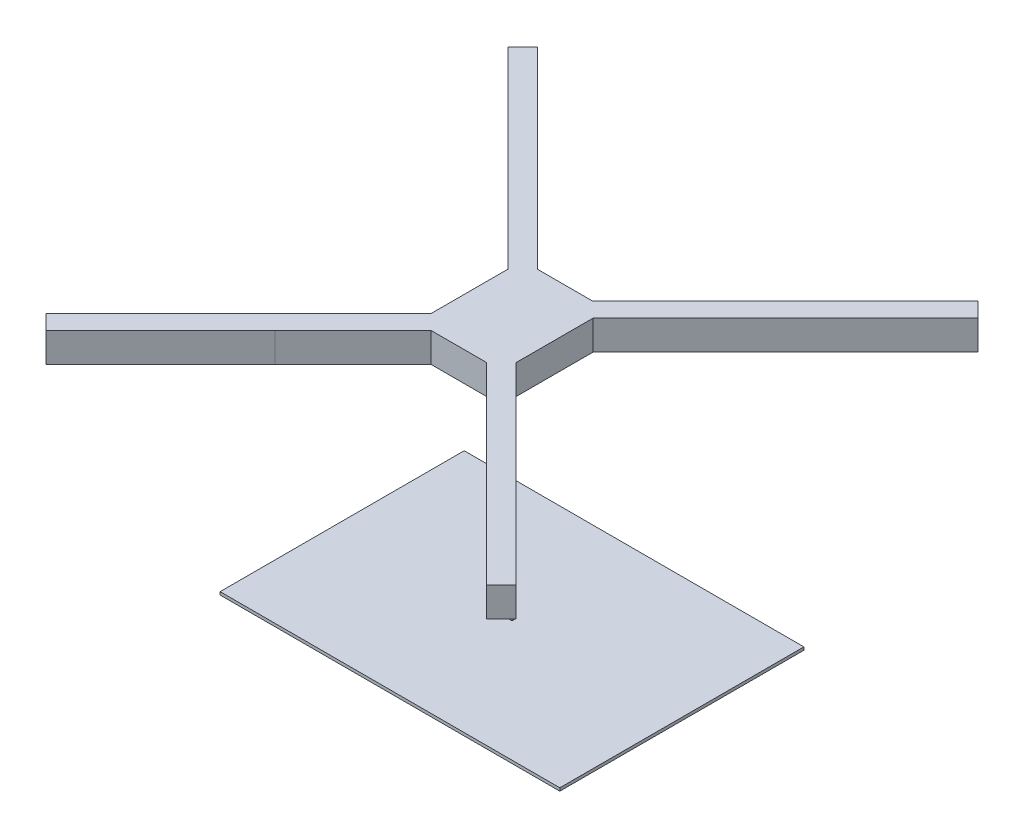
ISO-10303-21;
HEADER;
FILE_DESCRIPTION(('STEP AP214'),'2;1');
FILE_NAME('part.step','',(''),(''),'','','');
FILE_SCHEMA(('AUTOMOTIVE_DESIGN { 1 0 10303 214 1 1 1 1 }'));
ENDSEC;
DATA;
#1=APPLICATION_CONTEXT('core data for automotive mechanical design processes');
#2=APPLICATION_PROTOCOL_DEFINITION('international standard','automotive_design',2000,#1);
#3=PRODUCT_CONTEXT('',#1,'mechanical');
#4=PRODUCT('Part','Part','',(#3));
#5=PRODUCT_RELATED_PRODUCT_CATEGORY('part','',(#4));
#6=PRODUCT_DEFINITION_FORMATION('','',#4);
#7=PRODUCT_DEFINITION_CONTEXT('part definition',#1,'design');
#8=PRODUCT_DEFINITION('design','',#6,#7);
#9=PRODUCT_DEFINITION_SHAPE('','',#8);
#10=(LENGTH_UNIT() NAMED_UNIT(*) SI_UNIT(.MILLI.,.METRE.));
#11=(NAMED_UNIT(*) PLANE_ANGLE_UNIT() SI_UNIT($,.RADIAN.));
#12=(NAMED_UNIT(*) SI_UNIT($,.STERADIAN.) SOLID_ANGLE_UNIT());
#13=UNCERTAINTY_MEASURE_WITH_UNIT(LENGTH_MEASURE(1.E-05),#10,'distance_accuracy_value','');
#14=(GEOMETRIC_REPRESENTATION_CONTEXT(3) GLOBAL_UNCERTAINTY_ASSIGNED_CONTEXT((#13)) GLOBAL_UNIT_ASSIGNED_CONTEXT((#10,
#11,#12)) REPRESENTATION_CONTEXT('',''));
#15=CARTESIAN_POINT('',(0.,0.,0.));
#16=DIRECTION('',(0.,0.,1.));
#17=DIRECTION('',(1.,0.,0.));
#18=AXIS2_PLACEMENT_3D('',#15,#16,#17);
#19=CARTESIAN_POINT('',(37.7392834995965,40.,-72.1741021786564));
#20=DIRECTION('',(0.,0.,1.));
#21=DIRECTION('',(1.,0.,0.));
#22=AXIS2_PLACEMENT_3D('',#19,#20,#21);
#23=PLANE('',#22);
#24=DIRECTION('',(-1.,0.,0.));
#25=VECTOR('',#24,1.);
#26=CARTESIAN_POINT('',(37.7392834995965,0.,-72.1741021786564));
#27=LINE('',#26,#25);
#28=CARTESIAN_POINT('',(37.7392834995965,0.,-72.1741021786564));
#29=VERTEX_POINT('',#28);
#30=CARTESIAN_POINT('',(-37.7392819154021,0.,-72.1741021786564));
#31=VERTEX_POINT('',#30);
#32=EDGE_CURVE('E209',#29,#31,#27,.T.);
#33=ORIENTED_EDGE('',*,*,#32,.T.);
#34=DIRECTION('',(0.,-1.,0.));
#35=VECTOR('',#34,1.);
#36=CARTESIAN_POINT('',(-37.7392819154021,40.,-72.1741021786564));
#37=LINE('',#36,#35);
#38=CARTESIAN_POINT('',(-37.7392819154021,40.,-72.1741021786564));
#39=VERTEX_POINT('',#38);
#40=EDGE_CURVE('E11',#39,#31,#37,.T.);
#41=ORIENTED_EDGE('',*,*,#40,.F.);
#42=DIRECTION('',(-1.,0.,0.));
#43=VECTOR('',#42,1.);
#44=CARTESIAN_POINT('',(37.7392834995965,40.,-72.1741021786564));
#45=LINE('',#44,#43);
#46=CARTESIAN_POINT('',(37.7392834995965,40.,-72.1741021786564));
#47=VERTEX_POINT('',#46);
#48=EDGE_CURVE('E251',#47,#39,#45,.T.);
#49=ORIENTED_EDGE('',*,*,#48,.F.);
#50=DIRECTION('',(0.,-1.,0.));
#51=VECTOR('',#50,1.);
#52=CARTESIAN_POINT('',(37.7392834995965,40.,-72.1741021786564));
#53=LINE('',#52,#51);
#54=EDGE_CURVE('E205',#47,#29,#53,.T.);
#55=ORIENTED_EDGE('',*,*,#54,.T.);
#56=EDGE_LOOP('',(#33,#41,#49,#55));
#57=FACE_BOUND('',#56,.T.);
#58=ADVANCED_FACE('F37',(#57),#23,.F.);
#59=CARTESIAN_POINT('',(-143.805299093384,40.,-178.240119356639));
#60=DIRECTION('',(-0.707106781186548,0.,0.707106781186547));
#61=DIRECTION('',(0.707106781186547,0.,0.707106781186548));
#62=AXIS2_PLACEMENT_3D('',#59,#60,#61);
#63=PLANE('',#62);
#64=DIRECTION('',(-0.707106781186547,0.,-0.707106781186548));
#65=VECTOR('',#64,1.);
#66=CARTESIAN_POINT('',(-143.805299093384,0.,-178.240119356639));
#67=LINE('',#66,#65);
#68=CARTESIAN_POINT('',(-299.368790954425,0.,-333.803611217679));
#69=VERTEX_POINT('',#68);
#70=EDGE_CURVE('E212',#31,#69,#67,.T.);
#71=ORIENTED_EDGE('',*,*,#70,.T.);
#72=DIRECTION('',(0.,-1.,0.));
#73=VECTOR('',#72,1.);
#74=CARTESIAN_POINT('',(-299.368790954425,40.,-333.803611217679));
#75=LINE('',#74,#73);
#76=CARTESIAN_POINT('',(-299.368790954425,40.,-333.803611217679));
#77=VERTEX_POINT('',#76);
#78=EDGE_CURVE('E45',#77,#69,#75,.T.);
#79=ORIENTED_EDGE('',*,*,#78,.F.);
#80=DIRECTION('',(-0.707106781186548,0.,-0.707106781186547));
#81=VECTOR('',#80,1.);
#82=CARTESIAN_POINT('',(-37.7392819154021,40.,-72.1741021786564));
#83=LINE('',#82,#81);
#84=EDGE_CURVE('E133',#39,#77,#83,.T.);
#85=ORIENTED_EDGE('',*,*,#84,.F.);
#86=ORIENTED_EDGE('',*,*,#40,.T.);
#87=EDGE_LOOP('',(#71,#79,#85,#86));
#88=FACE_BOUND('',#87,.T.);
#89=ADVANCED_FACE('F368',(#88),#63,.F.);
#90=CARTESIAN_POINT('',(-299.368790954425,40.,-333.803611217679));
#91=DIRECTION('',(0.707106781186546,0.,0.707106781186549));
#92=DIRECTION('',(0.707106781186549,0.,-0.707106781186546));
#93=AXIS2_PLACEMENT_3D('',#90,#91,#92);
#94=PLANE('',#93);
#95=DIRECTION('',(-0.707106781186549,0.,0.707106781186546));
#96=VECTOR('',#95,1.);
#97=CARTESIAN_POINT('',(-299.368790954425,0.,-333.803611217679));
#98=LINE('',#97,#96);
#99=CARTESIAN_POINT('',(-319.36577072638,0.,-313.806631445723));
#100=VERTEX_POINT('',#99);
#101=EDGE_CURVE('E215',#69,#100,#98,.T.);
#102=ORIENTED_EDGE('',*,*,#101,.T.);
#103=DIRECTION('',(0.,-1.,0.));
#104=VECTOR('',#103,1.);
#105=CARTESIAN_POINT('',(-319.36577072638,40.,-313.806631445723));
#106=LINE('',#105,#104);
#107=CARTESIAN_POINT('',(-319.36577072638,40.,-313.806631445723));
#108=VERTEX_POINT('',#107);
#109=EDGE_CURVE('E294',#108,#100,#106,.T.);
#110=ORIENTED_EDGE('',*,*,#109,.F.);
#111=DIRECTION('',(-0.707106781186549,0.,0.707106781186546));
#112=VECTOR('',#111,1.);
#113=CARTESIAN_POINT('',(-299.368790954425,40.,-333.803611217679));
#114=LINE('',#113,#112);
#115=EDGE_CURVE('E302',#77,#108,#114,.T.);
#116=ORIENTED_EDGE('',*,*,#115,.F.);
#117=ORIENTED_EDGE('',*,*,#78,.T.);
#118=EDGE_LOOP('',(#102,#110,#116,#117));
#119=FACE_BOUND('',#118,.T.);
#120=ADVANCED_FACE('F300',(#119),#94,.F.);
#121=CARTESIAN_POINT('',(-163.802279668428,40.,-158.243140387771));
#122=DIRECTION('',(0.707106781186548,0.,-0.707106781186547));
#123=DIRECTION('',(-0.707106781186547,0.,-0.707106781186548));
#124=AXIS2_PLACEMENT_3D('',#121,#122,#123);
#125=PLANE('',#124);
#126=DIRECTION('',(0.707106781186547,0.,0.707106781186548));
#127=VECTOR('',#126,1.);
#128=CARTESIAN_POINT('',(-163.802279668428,0.,-158.243140387771));
#129=LINE('',#128,#127);
#130=CARTESIAN_POINT('',(-163.802279668428,0.,-158.243140387771));
#131=VERTEX_POINT('',#130);
#132=EDGE_CURVE('E217',#100,#131,#129,.T.);
#133=ORIENTED_EDGE('',*,*,#132,.T.);
#134=DIRECTION('',(0.,-1.,0.));
#135=VECTOR('',#134,1.);
#136=CARTESIAN_POINT('',(-163.802279668428,40.,-158.243140387771));
#137=LINE('',#136,#135);
#138=CARTESIAN_POINT('',(-163.802279668428,40.,-158.243140387771));
#139=VERTEX_POINT('',#138);
#140=EDGE_CURVE('E291',#139,#131,#137,.T.);
#141=ORIENTED_EDGE('',*,*,#140,.F.);
#142=DIRECTION('',(0.707106781186547,0.,0.707106781186548));
#143=VECTOR('',#142,1.);
#144=CARTESIAN_POINT('',(-163.802279668428,40.,-158.243140387771));
#145=LINE('',#144,#143);
#146=EDGE_CURVE('E320',#108,#139,#145,.T.);
#147=ORIENTED_EDGE('',*,*,#146,.F.);
#148=ORIENTED_EDGE('',*,*,#109,.T.);
#149=EDGE_LOOP('',(#133,#141,#147,#148));
#150=FACE_BOUND('',#149,.T.);
#151=ADVANCED_FACE('F311',(#150),#125,.F.);
#152=CARTESIAN_POINT('',(-163.802279668428,40.,-158.243140387771));
#153=DIRECTION('',(0.707126915378764,0.,-0.707086646421013));
#154=DIRECTION('',(-0.707086646421013,0.,-0.707126915378764));
#155=AXIS2_PLACEMENT_3D('',#152,#153,#154);
#156=PLANE('',#155);
#157=DIRECTION('',(0.707086646421013,0.,0.707126915378764));
#158=VECTOR('',#157,1.);
#159=CARTESIAN_POINT('',(-163.802279668428,0.,-158.243140387771));
#160=LINE('',#159,#158);
#161=CARTESIAN_POINT('',(-57.7392827052757,0.,-52.1741030809562));
#162=VERTEX_POINT('',#161);
#163=EDGE_CURVE('E219',#131,#162,#160,.T.);
#164=ORIENTED_EDGE('',*,*,#163,.T.);
#165=DIRECTION('',(0.,-1.,0.));
#166=VECTOR('',#165,1.);
#167=CARTESIAN_POINT('',(-57.7392827052757,40.,-52.1741030809562));
#168=LINE('',#167,#166);
#169=CARTESIAN_POINT('',(-57.7392827052757,40.,-52.1741030809562));
#170=VERTEX_POINT('',#169);
#171=EDGE_CURVE('E288',#170,#162,#168,.T.);
#172=ORIENTED_EDGE('',*,*,#171,.F.);
#173=DIRECTION('',(0.707086646421013,0.,0.707126915378764));
#174=VECTOR('',#173,1.);
#175=CARTESIAN_POINT('',(-163.802279668428,40.,-158.243140387771));
#176=LINE('',#175,#174);
#177=EDGE_CURVE('E317',#139,#170,#176,.T.);
#178=ORIENTED_EDGE('',*,*,#177,.F.);
#179=ORIENTED_EDGE('',*,*,#140,.T.);
#180=EDGE_LOOP('',(#164,#172,#178,#179));
#181=FACE_BOUND('',#180,.T.);
#182=ADVANCED_FACE('F315',(#181),#156,.F.);
#183=CARTESIAN_POINT('',(-57.7392827052757,40.,52.1741032715324));
#184=DIRECTION('',(1.,0.,0.));
#185=DIRECTION('',(0.,0.,-1.));
#186=AXIS2_PLACEMENT_3D('',#183,#184,#185);
#187=PLANE('',#186);
#188=DIRECTION('',(0.,0.,1.));
#189=VECTOR('',#188,1.);
#190=CARTESIAN_POINT('',(-57.7392827052757,0.,52.1741032715324));
#191=LINE('',#190,#189);
#192=CARTESIAN_POINT('',(-57.7392827052757,0.,52.1741032715324));
#193=VERTEX_POINT('',#192);
#194=EDGE_CURVE('E221',#162,#193,#191,.T.);
#195=ORIENTED_EDGE('',*,*,#194,.T.);
#196=DIRECTION('',(0.,-1.,0.));
#197=VECTOR('',#196,1.);
#198=CARTESIAN_POINT('',(-57.7392827052757,40.,52.1741032715324));
#199=LINE('',#198,#197);
#200=CARTESIAN_POINT('',(-57.7392827052757,40.,52.1741032715324));
#201=VERTEX_POINT('',#200);
#202=EDGE_CURVE('E285',#201,#193,#199,.T.);
#203=ORIENTED_EDGE('',*,*,#202,.F.);
#204=DIRECTION('',(0.,0.,1.));
#205=VECTOR('',#204,1.);
#206=CARTESIAN_POINT('',(-57.7392827052757,40.,52.1741032715324));
#207=LINE('',#206,#205);
#208=EDGE_CURVE('E319',#170,#201,#207,.T.);
#209=ORIENTED_EDGE('',*,*,#208,.F.);
#210=ORIENTED_EDGE('',*,*,#171,.T.);
#211=EDGE_LOOP('',(#195,#203,#209,#210));
#212=FACE_BOUND('',#211,.T.);
#213=ADVANCED_FACE('F381',(#212),#187,.F.);
#214=CARTESIAN_POINT('',(-163.802279840264,40.,158.24314040652));
#215=DIRECTION('',(0.707126914233252,0.,0.70708664756659));
#216=DIRECTION('',(0.70708664756659,0.,-0.707126914233252));
#217=AXIS2_PLACEMENT_3D('',#214,#215,#216);
#218=PLANE('',#217);
#219=DIRECTION('',(-0.70708664756659,0.,0.707126914233252));
#220=VECTOR('',#219,1.);
#221=CARTESIAN_POINT('',(-163.802279840264,0.,158.24314040652));
#222=LINE('',#221,#220);
#223=CARTESIAN_POINT('',(-319.361342304914,0.,313.811061537836));
#224=VERTEX_POINT('',#223);
#225=EDGE_CURVE('E224',#193,#224,#222,.T.);
#226=ORIENTED_EDGE('',*,*,#225,.T.);
#227=DIRECTION('',(0.,-1.,0.));
#228=VECTOR('',#227,1.);
#229=CARTESIAN_POINT('',(-319.361342304914,40.,313.811061537836));
#230=LINE('',#229,#228);
#231=CARTESIAN_POINT('',(-319.361342304914,40.,313.811061537836));
#232=VERTEX_POINT('',#231);
#233=EDGE_CURVE('E282',#232,#224,#230,.T.);
#234=ORIENTED_EDGE('',*,*,#233,.F.);
#235=DIRECTION('',(-0.70708664756659,0.,0.707126914233252));
#236=VECTOR('',#235,1.);
#237=CARTESIAN_POINT('',(-57.7392827052757,40.,52.1741032715324));
#238=LINE('',#237,#236);
#239=EDGE_CURVE('E322',#201,#232,#238,.T.);
#240=ORIENTED_EDGE('',*,*,#239,.F.);
#241=ORIENTED_EDGE('',*,*,#202,.T.);
#242=EDGE_LOOP('',(#226,#234,#240,#241));
#243=FACE_BOUND('',#242,.T.);
#244=ADVANCED_FACE('F384',(#243),#218,.F.);
#245=CARTESIAN_POINT('',(-319.361342304914,40.,313.811061537836));
#246=DIRECTION('',(0.70708664756659,0.,-0.707126914233251));
#247=DIRECTION('',(-0.707126914233252,0.,-0.707086647566591));
#248=AXIS2_PLACEMENT_3D('',#245,#246,#247);
#249=PLANE('',#248);
#250=DIRECTION('',(0.707126914233251,0.,0.70708664756659));
#251=VECTOR('',#250,1.);
#252=CARTESIAN_POINT('',(-319.361342304914,0.,313.811061537836));
#253=LINE('',#252,#251);
#254=CARTESIAN_POINT('',(-299.363793170398,0.,333.807471931019));
#255=VERTEX_POINT('',#254);
#256=EDGE_CURVE('E226',#224,#255,#253,.T.);
#257=ORIENTED_EDGE('',*,*,#256,.T.);
#258=DIRECTION('',(0.,-1.,0.));
#259=VECTOR('',#258,1.);
#260=CARTESIAN_POINT('',(-299.363793170398,40.,333.807471931019));
#261=LINE('',#260,#259);
#262=CARTESIAN_POINT('',(-299.363793170398,40.,333.807471931019));
#263=VERTEX_POINT('',#262);
#264=EDGE_CURVE('E279',#263,#255,#261,.T.);
#265=ORIENTED_EDGE('',*,*,#264,.F.);
#266=DIRECTION('',(0.707126914233251,0.,0.70708664756659));
#267=VECTOR('',#266,1.);
#268=CARTESIAN_POINT('',(-319.361342304914,40.,313.811061537836));
#269=LINE('',#268,#267);
#270=EDGE_CURVE('E328',#232,#263,#269,.T.);
#271=ORIENTED_EDGE('',*,*,#270,.F.);
#272=ORIENTED_EDGE('',*,*,#233,.T.);
#273=EDGE_LOOP('',(#257,#265,#271,#272));
#274=FACE_BOUND('',#273,.T.);
#275=ADVANCED_FACE('F388',(#274),#249,.F.);
#276=CARTESIAN_POINT('',(-143.805300025315,40.,178.240120135482));
#277=DIRECTION('',(-0.70712691427009,0.,-0.70708664752975));
#278=DIRECTION('',(-0.70708664752975,0.,0.70712691427009));
#279=AXIS2_PLACEMENT_3D('',#276,#277,#278);
#280=PLANE('',#279);
#281=DIRECTION('',(0.70708664752975,0.,-0.70712691427009));
#282=VECTOR('',#281,1.);
#283=CARTESIAN_POINT('',(-143.805300025315,0.,178.240120135482));
#284=LINE('',#283,#282);
#285=CARTESIAN_POINT('',(-143.805300025315,0.,178.240120135482));
#286=VERTEX_POINT('',#285);
#287=EDGE_CURVE('E228',#255,#286,#284,.T.);
#288=ORIENTED_EDGE('',*,*,#287,.T.);
#289=DIRECTION('',(0.,-1.,0.));
#290=VECTOR('',#289,1.);
#291=CARTESIAN_POINT('',(-143.805300025315,40.,178.240120135482));
#292=LINE('',#291,#290);
#293=CARTESIAN_POINT('',(-143.805300025315,40.,178.240120135482));
#294=VERTEX_POINT('',#293);
#295=EDGE_CURVE('E276',#294,#286,#292,.T.);
#296=ORIENTED_EDGE('',*,*,#295,.F.);
#297=DIRECTION('',(0.70708664752975,0.,-0.70712691427009));
#298=VECTOR('',#297,1.);
#299=CARTESIAN_POINT('',(-143.805300025315,40.,178.240120135482));
#300=LINE('',#299,#298);
#301=EDGE_CURVE('E330',#263,#294,#300,.T.);
#302=ORIENTED_EDGE('',*,*,#301,.F.);
#303=ORIENTED_EDGE('',*,*,#264,.T.);
#304=EDGE_LOOP('',(#288,#296,#302,#303));
#305=FACE_BOUND('',#304,.T.);
#306=ADVANCED_FACE('F392',(#305),#280,.F.);
#307=CARTESIAN_POINT('',(-143.805300025315,40.,178.240120135482));
#308=DIRECTION('',(-0.707106781186548,0.,-0.707106781186547));
#309=DIRECTION('',(-0.707106781186547,0.,0.707106781186548));
#310=AXIS2_PLACEMENT_3D('',#307,#308,#309);
#311=PLANE('',#310);
#312=DIRECTION('',(0.707106781186547,0.,-0.707106781186548));
#313=VECTOR('',#312,1.);
#314=CARTESIAN_POINT('',(-143.805300025315,0.,178.240120135482));
#315=LINE('',#314,#313);
#316=CARTESIAN_POINT('',(-37.7392828473326,0.,72.1741029574998));
#317=VERTEX_POINT('',#316);
#318=EDGE_CURVE('E230',#286,#317,#315,.T.);
#319=ORIENTED_EDGE('',*,*,#318,.T.);
#320=DIRECTION('',(0.,-1.,0.));
#321=VECTOR('',#320,1.);
#322=CARTESIAN_POINT('',(-37.7392828473326,40.,72.1741029574998));
#323=LINE('',#322,#321);
#324=CARTESIAN_POINT('',(-37.7392828473326,40.,72.1741029574998));
#325=VERTEX_POINT('',#324);
#326=EDGE_CURVE('E273',#325,#317,#323,.T.);
#327=ORIENTED_EDGE('',*,*,#326,.F.);
#328=DIRECTION('',(0.707106781186547,0.,-0.707106781186548));
#329=VECTOR('',#328,1.);
#330=CARTESIAN_POINT('',(-143.805300025315,40.,178.240120135482));
#331=LINE('',#330,#329);
#332=EDGE_CURVE('E332',#294,#325,#331,.T.);
#333=ORIENTED_EDGE('',*,*,#332,.F.);
#334=ORIENTED_EDGE('',*,*,#295,.T.);
#335=EDGE_LOOP('',(#319,#327,#333,#334));
#336=FACE_BOUND('',#335,.T.);
#337=ADVANCED_FACE('F396',(#336),#311,.F.);
#338=CARTESIAN_POINT('',(-37.7392828473326,40.,72.1741029574998));
#339=DIRECTION('',(0.,0.,-1.));
#340=DIRECTION('',(-1.,0.,0.));
#341=AXIS2_PLACEMENT_3D('',#338,#339,#340);
#342=PLANE('',#341);
#343=DIRECTION('',(1.,0.,0.));
#344=VECTOR('',#343,1.);
#345=CARTESIAN_POINT('',(-37.7392828473326,0.,72.1741029574998));
#346=LINE('',#345,#344);
#347=CARTESIAN_POINT('',(37.739282893414,0.,72.1741029574998));
#348=VERTEX_POINT('',#347);
#349=EDGE_CURVE('E232',#317,#348,#346,.T.);
#350=ORIENTED_EDGE('',*,*,#349,.T.);
#351=DIRECTION('',(0.,-1.,0.));
#352=VECTOR('',#351,1.);
#353=CARTESIAN_POINT('',(37.739282893414,40.,72.1741029574998));
#354=LINE('',#353,#352);
#355=CARTESIAN_POINT('',(37.739282893414,40.,72.1741029574998));
#356=VERTEX_POINT('',#355);
#357=EDGE_CURVE('E270',#356,#348,#354,.T.);
#358=ORIENTED_EDGE('',*,*,#357,.F.);
#359=DIRECTION('',(1.,0.,0.));
#360=VECTOR('',#359,1.);
#361=CARTESIAN_POINT('',(-37.7392828473326,40.,72.1741029574998));
#362=LINE('',#361,#360);
#363=EDGE_CURVE('E334',#325,#356,#362,.T.);
#364=ORIENTED_EDGE('',*,*,#363,.F.);
#365=ORIENTED_EDGE('',*,*,#326,.T.);
#366=EDGE_LOOP('',(#350,#358,#364,#365));
#367=FACE_BOUND('',#366,.T.);
#368=ADVANCED_FACE('F400',(#367),#342,.F.);
#369=CARTESIAN_POINT('',(143.805300071396,40.,178.240120135482));
#370=DIRECTION('',(0.707106781186548,0.,-0.707106781186547));
#371=DIRECTION('',(-0.707106781186547,0.,-0.707106781186548));
#372=AXIS2_PLACEMENT_3D('',#369,#370,#371);
#373=PLANE('',#372);
#374=DIRECTION('',(0.707106781186547,0.,0.707106781186548));
#375=VECTOR('',#374,1.);
#376=CARTESIAN_POINT('',(143.805300071396,0.,178.240120135482));
#377=LINE('',#376,#375);
#378=CARTESIAN_POINT('',(299.368791932436,0.,333.803611996522));
#379=VERTEX_POINT('',#378);
#380=EDGE_CURVE('E235',#348,#379,#377,.T.);
#381=ORIENTED_EDGE('',*,*,#380,.T.);
#382=DIRECTION('',(0.,-1.,0.));
#383=VECTOR('',#382,1.);
#384=CARTESIAN_POINT('',(299.368791932436,40.,333.803611996522));
#385=LINE('',#384,#383);
#386=CARTESIAN_POINT('',(299.368791932436,40.,333.803611996522));
#387=VERTEX_POINT('',#386);
#388=EDGE_CURVE('E267',#387,#379,#385,.T.);
#389=ORIENTED_EDGE('',*,*,#388,.F.);
#390=DIRECTION('',(0.707106781186548,0.,0.707106781186548));
#391=VECTOR('',#390,1.);
#392=CARTESIAN_POINT('',(37.739282893414,40.,72.1741029574998));
#393=LINE('',#392,#391);
#394=EDGE_CURVE('E336',#356,#387,#393,.T.);
#395=ORIENTED_EDGE('',*,*,#394,.F.);
#396=ORIENTED_EDGE('',*,*,#357,.T.);
#397=EDGE_LOOP('',(#381,#389,#395,#396));
#398=FACE_BOUND('',#397,.T.);
#399=ADVANCED_FACE('F404',(#398),#373,.F.);
#400=CARTESIAN_POINT('',(299.368791932436,40.,333.803611996522));
#401=DIRECTION('',(-0.707106781186548,0.,-0.707106781186547));
#402=DIRECTION('',(-0.707106781186547,0.,0.707106781186548));
#403=AXIS2_PLACEMENT_3D('',#400,#401,#402);
#404=PLANE('',#403);
#405=DIRECTION('',(0.707106781186547,0.,-0.707106781186548));
#406=VECTOR('',#405,1.);
#407=CARTESIAN_POINT('',(299.368791932436,0.,333.803611996522));
#408=LINE('',#407,#406);
#409=CARTESIAN_POINT('',(319.365771704392,0.,313.806632224567));
#410=VERTEX_POINT('',#409);
#411=EDGE_CURVE('E237',#379,#410,#408,.T.);
#412=ORIENTED_EDGE('',*,*,#411,.T.);
#413=DIRECTION('',(0.,-1.,0.));
#414=VECTOR('',#413,1.);
#415=CARTESIAN_POINT('',(319.365771704392,40.,313.806632224567));
#416=LINE('',#415,#414);
#417=CARTESIAN_POINT('',(319.365771704392,40.,313.806632224567));
#418=VERTEX_POINT('',#417);
#419=EDGE_CURVE('E264',#418,#410,#416,.T.);
#420=ORIENTED_EDGE('',*,*,#419,.F.);
#421=DIRECTION('',(0.707106781186547,0.,-0.707106781186548));
#422=VECTOR('',#421,1.);
#423=CARTESIAN_POINT('',(299.368791932436,40.,333.803611996522));
#424=LINE('',#423,#422);
#425=EDGE_CURVE('E338',#387,#418,#424,.T.);
#426=ORIENTED_EDGE('',*,*,#425,.F.);
#427=ORIENTED_EDGE('',*,*,#388,.T.);
#428=EDGE_LOOP('',(#412,#420,#426,#427));
#429=FACE_BOUND('',#428,.T.);
#430=ADVANCED_FACE('F408',(#429),#404,.F.);
#431=CARTESIAN_POINT('',(319.365771704392,40.,313.806632224567));
#432=DIRECTION('',(-0.707106781186547,0.,0.707106781186548));
#433=DIRECTION('',(0.707106781186548,0.,0.707106781186547));
#434=AXIS2_PLACEMENT_3D('',#431,#432,#433);
#435=PLANE('',#434);
#436=DIRECTION('',(-0.707106781186548,0.,-0.707106781186547));
#437=VECTOR('',#436,1.);
#438=CARTESIAN_POINT('',(319.365771704392,0.,313.806632224567));
#439=LINE('',#438,#437);
#440=CARTESIAN_POINT('',(163.802280352179,0.,158.243140872353));
#441=VERTEX_POINT('',#440);
#442=EDGE_CURVE('E239',#410,#441,#439,.T.);
#443=ORIENTED_EDGE('',*,*,#442,.T.);
#444=DIRECTION('',(0.,-1.,0.));
#445=VECTOR('',#444,1.);
#446=CARTESIAN_POINT('',(163.802280352179,40.,158.243140872353));
#447=LINE('',#446,#445);
#448=CARTESIAN_POINT('',(163.802280352179,40.,158.243140872353));
#449=VERTEX_POINT('',#448);
#450=EDGE_CURVE('E261',#449,#441,#447,.T.);
#451=ORIENTED_EDGE('',*,*,#450,.F.);
#452=DIRECTION('',(-0.707106781186548,0.,-0.707106781186547));
#453=VECTOR('',#452,1.);
#454=CARTESIAN_POINT('',(319.365771704392,40.,313.806632224567));
#455=LINE('',#454,#453);
#456=EDGE_CURVE('E340',#418,#449,#455,.T.);
#457=ORIENTED_EDGE('',*,*,#456,.F.);
#458=ORIENTED_EDGE('',*,*,#419,.T.);
#459=EDGE_LOOP('',(#443,#451,#457,#458));
#460=FACE_BOUND('',#459,.T.);
#461=ADVANCED_FACE('F412',(#460),#435,.F.);
#462=CARTESIAN_POINT('',(163.802280352179,40.,158.243140872353));
#463=DIRECTION('',(-0.707126915313853,0.,0.707086646485928));
#464=DIRECTION('',(0.707086646485928,0.,0.707126915313853));
#465=AXIS2_PLACEMENT_3D('',#462,#463,#464);
#466=PLANE('',#465);
#467=DIRECTION('',(-0.707086646485928,0.,-0.707126915313853));
#468=VECTOR('',#467,1.);
#469=CARTESIAN_POINT('',(163.802280352179,0.,158.243140872353));
#470=LINE('',#469,#468);
#471=CARTESIAN_POINT('',(57.7392833792894,0.,52.1741035752755));
#472=VERTEX_POINT('',#471);
#473=EDGE_CURVE('E241',#441,#472,#470,.T.);
#474=ORIENTED_EDGE('',*,*,#473,.T.);
#475=DIRECTION('',(0.,-1.,0.));
#476=VECTOR('',#475,1.);
#477=CARTESIAN_POINT('',(57.7392833792894,40.,52.1741035752755));
#478=LINE('',#477,#476);
#479=CARTESIAN_POINT('',(57.7392833792894,40.,52.1741035752755));
#480=VERTEX_POINT('',#479);
#481=EDGE_CURVE('E258',#480,#472,#478,.T.);
#482=ORIENTED_EDGE('',*,*,#481,.F.);
#483=DIRECTION('',(-0.707086646485928,0.,-0.707126915313853));
#484=VECTOR('',#483,1.);
#485=CARTESIAN_POINT('',(163.802280352179,40.,158.243140872353));
#486=LINE('',#485,#484);
#487=EDGE_CURVE('E342',#449,#480,#486,.T.);
#488=ORIENTED_EDGE('',*,*,#487,.F.);
#489=ORIENTED_EDGE('',*,*,#450,.T.);
#490=EDGE_LOOP('',(#474,#482,#488,#489));
#491=FACE_BOUND('',#490,.T.);
#492=ADVANCED_FACE('F416',(#491),#466,.F.);
#493=CARTESIAN_POINT('',(57.7392833792894,40.,-52.174102470969));
#494=DIRECTION('',(-1.,0.,0.));
#495=DIRECTION('',(0.,0.,1.));
#496=AXIS2_PLACEMENT_3D('',#493,#494,#495);
#497=PLANE('',#496);
#498=DIRECTION('',(0.,0.,-1.));
#499=VECTOR('',#498,1.);
#500=CARTESIAN_POINT('',(57.7392833792894,0.,-52.174102470969));
#501=LINE('',#500,#499);
#502=CARTESIAN_POINT('',(57.7392833792894,0.,-52.174102470969));
#503=VERTEX_POINT('',#502);
#504=EDGE_CURVE('E243',#472,#503,#501,.T.);
#505=ORIENTED_EDGE('',*,*,#504,.T.);
#506=DIRECTION('',(0.,-1.,0.));
#507=VECTOR('',#506,1.);
#508=CARTESIAN_POINT('',(57.7392833792894,40.,-52.174102470969));
#509=LINE('',#508,#507);
#510=CARTESIAN_POINT('',(57.7392833792894,40.,-52.174102470969));
#511=VERTEX_POINT('',#510);
#512=EDGE_CURVE('E255',#511,#503,#509,.T.);
#513=ORIENTED_EDGE('',*,*,#512,.F.);
#514=DIRECTION('',(0.,0.,-1.));
#515=VECTOR('',#514,1.);
#516=CARTESIAN_POINT('',(57.7392833792894,40.,-52.174102470969));
#517=LINE('',#516,#515);
#518=EDGE_CURVE('E344',#480,#511,#517,.T.);
#519=ORIENTED_EDGE('',*,*,#518,.F.);
#520=ORIENTED_EDGE('',*,*,#481,.T.);
#521=EDGE_LOOP('',(#505,#513,#519,#520));
#522=FACE_BOUND('',#521,.T.);
#523=ADVANCED_FACE('F350',(#522),#497,.F.);
#524=CARTESIAN_POINT('',(163.802280508752,40.,-158.243139611482));
#525=DIRECTION('',(-0.70712691427009,0.,-0.70708664752975));
#526=DIRECTION('',(-0.70708664752975,0.,0.70712691427009));
#527=AXIS2_PLACEMENT_3D('',#524,#525,#526);
#528=PLANE('',#527);
#529=DIRECTION('',(0.70708664752975,0.,-0.70712691427009));
#530=VECTOR('',#529,1.);
#531=CARTESIAN_POINT('',(163.802280508752,0.,-158.243139611482));
#532=LINE('',#531,#530);
#533=CARTESIAN_POINT('',(319.361342965297,0.,-313.811060750902));
#534=VERTEX_POINT('',#533);
#535=EDGE_CURVE('E246',#503,#534,#532,.T.);
#536=ORIENTED_EDGE('',*,*,#535,.T.);
#537=DIRECTION('',(0.,-1.,0.));
#538=VECTOR('',#537,1.);
#539=CARTESIAN_POINT('',(319.361342965297,40.,-313.811060750902));
#540=LINE('',#539,#538);
#541=CARTESIAN_POINT('',(319.361342965297,40.,-313.811060750902));
#542=VERTEX_POINT('',#541);
#543=EDGE_CURVE('E200',#542,#534,#540,.T.);
#544=ORIENTED_EDGE('',*,*,#543,.F.);
#545=DIRECTION('',(0.70708664752975,0.,-0.70712691427009));
#546=VECTOR('',#545,1.);
#547=CARTESIAN_POINT('',(163.802280508752,40.,-158.243139611482));
#548=LINE('',#547,#546);
#549=EDGE_CURVE('E191',#511,#542,#548,.T.);
#550=ORIENTED_EDGE('',*,*,#549,.F.);
#551=ORIENTED_EDGE('',*,*,#512,.T.);
#552=EDGE_LOOP('',(#536,#544,#550,#551));
#553=FACE_BOUND('',#552,.T.);
#554=ADVANCED_FACE('F353',(#553),#528,.F.);
#555=CARTESIAN_POINT('',(319.361342965297,40.,-313.811060750902));
#556=DIRECTION('',(-0.707086647529751,0.,0.707126914270089));
#557=DIRECTION('',(0.707126914270089,0.,0.707086647529751));
#558=AXIS2_PLACEMENT_3D('',#555,#556,#557);
#559=PLANE('',#558);
#560=DIRECTION('',(-0.707126914270089,0.,-0.707086647529751));
#561=VECTOR('',#560,1.);
#562=CARTESIAN_POINT('',(319.361342965297,0.,-313.811060750902));
#563=LINE('',#562,#561);
#564=CARTESIAN_POINT('',(299.363793829739,0.,-333.807471143044));
#565=VERTEX_POINT('',#564);
#566=EDGE_CURVE('E199',#534,#565,#563,.T.);
#567=ORIENTED_EDGE('',*,*,#566,.T.);
#568=DIRECTION('',(0.,-1.,0.));
#569=VECTOR('',#568,1.);
#570=CARTESIAN_POINT('',(299.363793829739,40.,-333.807471143044));
#571=LINE('',#570,#569);
#572=CARTESIAN_POINT('',(299.363793829739,40.,-333.807471143044));
#573=VERTEX_POINT('',#572);
#574=EDGE_CURVE('E196',#573,#565,#571,.T.);
#575=ORIENTED_EDGE('',*,*,#574,.F.);
#576=DIRECTION('',(-0.707126914270089,0.,-0.707086647529751));
#577=VECTOR('',#576,1.);
#578=CARTESIAN_POINT('',(319.361342965297,40.,-313.811060750902));
#579=LINE('',#578,#577);
#580=EDGE_CURVE('E185',#542,#573,#579,.T.);
#581=ORIENTED_EDGE('',*,*,#580,.F.);
#582=ORIENTED_EDGE('',*,*,#543,.T.);
#583=EDGE_LOOP('',(#567,#575,#581,#582));
#584=FACE_BOUND('',#583,.T.);
#585=ADVANCED_FACE('F197',(#584),#559,.F.);
#586=CARTESIAN_POINT('',(143.805300677579,40.,-178.240119356639));
#587=DIRECTION('',(0.707126914233252,0.,0.70708664756659));
#588=DIRECTION('',(0.70708664756659,0.,-0.707126914233252));
#589=AXIS2_PLACEMENT_3D('',#586,#587,#588);
#590=PLANE('',#589);
#591=DIRECTION('',(-0.70708664756659,0.,0.707126914233252));
#592=VECTOR('',#591,1.);
#593=CARTESIAN_POINT('',(143.805300677579,0.,-178.240119356639));
#594=LINE('',#593,#592);
#595=CARTESIAN_POINT('',(143.805300677579,0.,-178.240119356639));
#596=VERTEX_POINT('',#595);
#597=EDGE_CURVE('E119',#565,#596,#594,.T.);
#598=ORIENTED_EDGE('',*,*,#597,.T.);
#599=DIRECTION('',(0.,-1.,0.));
#600=VECTOR('',#599,1.);
#601=CARTESIAN_POINT('',(143.805300677579,40.,-178.240119356639));
#602=LINE('',#601,#600);
#603=CARTESIAN_POINT('',(143.805300677579,40.,-178.240119356639));
#604=VERTEX_POINT('',#603);
#605=EDGE_CURVE('E201',#604,#596,#602,.T.);
#606=ORIENTED_EDGE('',*,*,#605,.F.);
#607=DIRECTION('',(-0.70708664756659,0.,0.707126914233252));
#608=VECTOR('',#607,1.);
#609=CARTESIAN_POINT('',(143.805300677579,40.,-178.240119356639));
#610=LINE('',#609,#608);
#611=EDGE_CURVE('E189',#573,#604,#610,.T.);
#612=ORIENTED_EDGE('',*,*,#611,.F.);
#613=ORIENTED_EDGE('',*,*,#574,.T.);
#614=EDGE_LOOP('',(#598,#606,#612,#613));
#615=FACE_BOUND('',#614,.T.);
#616=ADVANCED_FACE('F203',(#615),#590,.F.);
#617=CARTESIAN_POINT('',(37.7392834995965,40.,-72.1741021786564));
#618=DIRECTION('',(0.707106781186548,0.,0.707106781186547));
#619=DIRECTION('',(0.707106781186547,0.,-0.707106781186548));
#620=AXIS2_PLACEMENT_3D('',#617,#618,#619);
#621=PLANE('',#620);
#622=DIRECTION('',(-0.707106781186547,0.,0.707106781186548));
#623=VECTOR('',#622,1.);
#624=CARTESIAN_POINT('',(37.7392834995965,0.,-72.1741021786564));
#625=LINE('',#624,#623);
#626=EDGE_CURVE('E125',#596,#29,#625,.T.);
#627=ORIENTED_EDGE('',*,*,#626,.T.);
#628=ORIENTED_EDGE('',*,*,#54,.F.);
#629=DIRECTION('',(-0.707106781186547,0.,0.707106781186548));
#630=VECTOR('',#629,1.);
#631=CARTESIAN_POINT('',(37.7392834995965,40.,-72.1741021786564));
#632=LINE('',#631,#630);
#633=EDGE_CURVE('E53',#604,#47,#632,.T.);
#634=ORIENTED_EDGE('',*,*,#633,.F.);
#635=ORIENTED_EDGE('',*,*,#605,.T.);
#636=EDGE_LOOP('',(#627,#628,#634,#635));
#637=FACE_BOUND('',#636,.T.);
#638=ADVANCED_FACE('F357',(#637),#621,.F.);
#639=CARTESIAN_POINT('',(0.,40.,0.));
#640=DIRECTION('',(0.,-1.,0.));
#641=DIRECTION('',(0.,0.,-1.));
#642=AXIS2_PLACEMENT_3D('',#639,#640,#641);
#643=PLANE('',#642);
#644=ORIENTED_EDGE('',*,*,#48,.T.);
#645=ORIENTED_EDGE('',*,*,#84,.T.);
#646=ORIENTED_EDGE('',*,*,#115,.T.);
#647=ORIENTED_EDGE('',*,*,#146,.T.);
#648=ORIENTED_EDGE('',*,*,#177,.T.);
#649=ORIENTED_EDGE('',*,*,#208,.T.);
#650=ORIENTED_EDGE('',*,*,#239,.T.);
#651=ORIENTED_EDGE('',*,*,#270,.T.);
#652=ORIENTED_EDGE('',*,*,#301,.T.);
#653=ORIENTED_EDGE('',*,*,#332,.T.);
#654=ORIENTED_EDGE('',*,*,#363,.T.);
#655=ORIENTED_EDGE('',*,*,#394,.T.);
#656=ORIENTED_EDGE('',*,*,#425,.T.);
#657=ORIENTED_EDGE('',*,*,#456,.T.);
#658=ORIENTED_EDGE('',*,*,#487,.T.);
#659=ORIENTED_EDGE('',*,*,#518,.T.);
#660=ORIENTED_EDGE('',*,*,#549,.T.);
#661=ORIENTED_EDGE('',*,*,#580,.T.);
#662=ORIENTED_EDGE('',*,*,#611,.T.);
#663=ORIENTED_EDGE('',*,*,#633,.T.);
#664=EDGE_LOOP('',(#644,#645,#646,#647,#648,#649,#650,#651,#652,#653,#654,#655,#656,#657,#658,
#659,#660,#661,#662,#663));
#665=FACE_BOUND('',#664,.T.);
#666=ADVANCED_FACE('F187',(#665),#643,.F.);
#667=CARTESIAN_POINT('',(0.,0.,0.));
#668=DIRECTION('',(0.,-1.,0.));
#669=DIRECTION('',(0.,0.,-1.));
#670=AXIS2_PLACEMENT_3D('',#667,#668,#669);
#671=PLANE('',#670);
#672=CARTESIAN_POINT('',(0.,0.,0.));
#673=DIRECTION('',(0.,-1.,0.));
#674=DIRECTION('',(0.,0.,-1.));
#675=AXIS2_PLACEMENT_3D('',#672,#673,#674);
#676=CIRCLE('',#675,2.);
#677=CARTESIAN_POINT('',(0.,0.,-2.));
#678=VERTEX_POINT('',#677);
#679=EDGE_CURVE('E564',#678,#678,#676,.T.);
#680=ORIENTED_EDGE('',*,*,#679,.F.);
#681=EDGE_LOOP('',(#680));
#682=FACE_BOUND('',#681,.T.);
#683=ORIENTED_EDGE('',*,*,#32,.F.);
#684=ORIENTED_EDGE('',*,*,#626,.F.);
#685=ORIENTED_EDGE('',*,*,#597,.F.);
#686=ORIENTED_EDGE('',*,*,#566,.F.);
#687=ORIENTED_EDGE('',*,*,#535,.F.);
#688=ORIENTED_EDGE('',*,*,#504,.F.);
#689=ORIENTED_EDGE('',*,*,#473,.F.);
#690=ORIENTED_EDGE('',*,*,#442,.F.);
#691=ORIENTED_EDGE('',*,*,#411,.F.);
#692=ORIENTED_EDGE('',*,*,#380,.F.);
#693=ORIENTED_EDGE('',*,*,#349,.F.);
#694=ORIENTED_EDGE('',*,*,#318,.F.);
#695=ORIENTED_EDGE('',*,*,#287,.F.);
#696=ORIENTED_EDGE('',*,*,#256,.F.);
#697=ORIENTED_EDGE('',*,*,#225,.F.);
#698=ORIENTED_EDGE('',*,*,#194,.F.);
#699=ORIENTED_EDGE('',*,*,#163,.F.);
#700=ORIENTED_EDGE('',*,*,#132,.F.);
#701=ORIENTED_EDGE('',*,*,#101,.F.);
#702=ORIENTED_EDGE('',*,*,#70,.F.);
#703=EDGE_LOOP('',(#683,#684,#685,#686,#687,#688,#689,#690,#691,#692,#693,#694,#695,#696,#697,
#698,#699,#700,#701,#702));
#704=FACE_BOUND('',#703,.T.);
#705=ADVANCED_FACE('F306',(#682,#704),#671,.T.);
#706=CARTESIAN_POINT('',(0.,-317.,0.));
#707=DIRECTION('',(0.,1.,0.));
#708=DIRECTION('',(0.,0.,1.));
#709=AXIS2_PLACEMENT_3D('',#706,#707,#708);
#710=CYLINDRICAL_SURFACE('',#709,2.);
#711=CARTESIAN_POINT('',(0.,-317.,0.));
#712=DIRECTION('',(0.,-1.,0.));
#713=DIRECTION('',(0.,0.,-1.));
#714=AXIS2_PLACEMENT_3D('',#711,#712,#713);
#715=CIRCLE('',#714,2.);
#716=CARTESIAN_POINT('',(0.,-317.,-2.));
#717=VERTEX_POINT('',#716);
#718=EDGE_CURVE('E213',#717,#717,#715,.T.);
#719=ORIENTED_EDGE('',*,*,#718,.F.);
#720=EDGE_LOOP('',(#719));
#721=FACE_BOUND('',#720,.T.);
#722=ORIENTED_EDGE('',*,*,#679,.T.);
#723=EDGE_LOOP('',(#722));
#724=FACE_BOUND('',#723,.T.);
#725=ADVANCED_FACE('F453',(#721,#724),#710,.T.);
#726=CARTESIAN_POINT('',(-230.790213370611,-321.,165.812988092497));
#727=DIRECTION('',(1.,0.,0.));
#728=DIRECTION('',(0.,0.,-1.));
#729=AXIS2_PLACEMENT_3D('',#726,#727,#728);
#730=PLANE('',#729);
#731=DIRECTION('',(0.,0.,-1.));
#732=VECTOR('',#731,1.);
#733=CARTESIAN_POINT('',(-230.790213370611,-317.,165.812988092497));
#734=LINE('',#733,#732);
#735=CARTESIAN_POINT('',(-230.790213370611,-317.,165.812988092497));
#736=VERTEX_POINT('',#735);
#737=CARTESIAN_POINT('',(-230.790213370611,-317.,-165.812988092497));
#738=VERTEX_POINT('',#737);
#739=EDGE_CURVE('E531',#736,#738,#734,.T.);
#740=ORIENTED_EDGE('',*,*,#739,.T.);
#741=DIRECTION('',(0.,1.,0.));
#742=VECTOR('',#741,1.);
#743=CARTESIAN_POINT('',(-230.790213370611,-321.,-165.812988092497));
#744=LINE('',#743,#742);
#745=CARTESIAN_POINT('',(-230.790213370611,-321.,-165.812988092497));
#746=VERTEX_POINT('',#745);
#747=EDGE_CURVE('E562',#746,#738,#744,.T.);
#748=ORIENTED_EDGE('',*,*,#747,.F.);
#749=DIRECTION('',(0.,0.,-1.));
#750=VECTOR('',#749,1.);
#751=CARTESIAN_POINT('',(-230.790213370611,-321.,165.812988092497));
#752=LINE('',#751,#750);
#753=CARTESIAN_POINT('',(-230.790213370611,-321.,165.812988092497));
#754=VERTEX_POINT('',#753);
#755=EDGE_CURVE('E553',#754,#746,#752,.T.);
#756=ORIENTED_EDGE('',*,*,#755,.F.);
#757=DIRECTION('',(0.,1.,0.));
#758=VECTOR('',#757,1.);
#759=CARTESIAN_POINT('',(-230.790213370611,-321.,165.812988092497));
#760=LINE('',#759,#758);
#761=EDGE_CURVE('E554',#754,#736,#760,.T.);
#762=ORIENTED_EDGE('',*,*,#761,.T.);
#763=EDGE_LOOP('',(#740,#748,#756,#762));
#764=FACE_BOUND('',#763,.T.);
#765=ADVANCED_FACE('F460',(#764),#730,.F.);
#766=CARTESIAN_POINT('',(230.790213370611,-321.,-165.812988092497));
#767=DIRECTION('',(0.,0.,1.));
#768=DIRECTION('',(1.,0.,0.));
#769=AXIS2_PLACEMENT_3D('',#766,#767,#768);
#770=PLANE('',#769);
#771=DIRECTION('',(1.,0.,0.));
#772=VECTOR('',#771,1.);
#773=CARTESIAN_POINT('',(230.790213370611,-317.,-165.812988092497));
#774=LINE('',#773,#772);
#775=CARTESIAN_POINT('',(230.790213370611,-317.,-165.812988092497));
#776=VERTEX_POINT('',#775);
#777=EDGE_CURVE('E538',#738,#776,#774,.T.);
#778=ORIENTED_EDGE('',*,*,#777,.T.);
#779=DIRECTION('',(0.,1.,0.));
#780=VECTOR('',#779,1.);
#781=CARTESIAN_POINT('',(230.790213370611,-321.,-165.812988092497));
#782=LINE('',#781,#780);
#783=CARTESIAN_POINT('',(230.790213370611,-321.,-165.812988092497));
#784=VERTEX_POINT('',#783);
#785=EDGE_CURVE('E559',#784,#776,#782,.T.);
#786=ORIENTED_EDGE('',*,*,#785,.F.);
#787=DIRECTION('',(1.,0.,0.));
#788=VECTOR('',#787,1.);
#789=CARTESIAN_POINT('',(230.790213370611,-321.,-165.812988092497));
#790=LINE('',#789,#788);
#791=EDGE_CURVE('E575',#746,#784,#790,.T.);
#792=ORIENTED_EDGE('',*,*,#791,.F.);
#793=ORIENTED_EDGE('',*,*,#747,.T.);
#794=EDGE_LOOP('',(#778,#786,#792,#793));
#795=FACE_BOUND('',#794,.T.);
#796=ADVANCED_FACE('F470',(#795),#770,.F.);
#797=CARTESIAN_POINT('',(230.790213370611,-321.,165.812988092497));
#798=DIRECTION('',(-1.,0.,0.));
#799=DIRECTION('',(0.,0.,1.));
#800=AXIS2_PLACEMENT_3D('',#797,#798,#799);
#801=PLANE('',#800);
#802=DIRECTION('',(0.,0.,1.));
#803=VECTOR('',#802,1.);
#804=CARTESIAN_POINT('',(230.790213370611,-317.,165.812988092497));
#805=LINE('',#804,#803);
#806=CARTESIAN_POINT('',(230.790213370611,-317.,165.812988092497));
#807=VERTEX_POINT('',#806);
#808=EDGE_CURVE('E544',#776,#807,#805,.T.);
#809=ORIENTED_EDGE('',*,*,#808,.T.);
#810=DIRECTION('',(0.,1.,0.));
#811=VECTOR('',#810,1.);
#812=CARTESIAN_POINT('',(230.790213370611,-321.,165.812988092497));
#813=LINE('',#812,#811);
#814=CARTESIAN_POINT('',(230.790213370611,-321.,165.812988092497));
#815=VERTEX_POINT('',#814);
#816=EDGE_CURVE('E556',#815,#807,#813,.T.);
#817=ORIENTED_EDGE('',*,*,#816,.F.);
#818=DIRECTION('',(0.,0.,1.));
#819=VECTOR('',#818,1.);
#820=CARTESIAN_POINT('',(230.790213370611,-321.,165.812988092497));
#821=LINE('',#820,#819);
#822=EDGE_CURVE('E592',#784,#815,#821,.T.);
#823=ORIENTED_EDGE('',*,*,#822,.F.);
#824=ORIENTED_EDGE('',*,*,#785,.T.);
#825=EDGE_LOOP('',(#809,#817,#823,#824));
#826=FACE_BOUND('',#825,.T.);
#827=ADVANCED_FACE('F480',(#826),#801,.F.);
#828=CARTESIAN_POINT('',(230.790213370611,-321.,165.812988092497));
#829=DIRECTION('',(0.,0.,-1.));
#830=DIRECTION('',(-1.,0.,0.));
#831=AXIS2_PLACEMENT_3D('',#828,#829,#830);
#832=PLANE('',#831);
#833=DIRECTION('',(-1.,0.,0.));
#834=VECTOR('',#833,1.);
#835=CARTESIAN_POINT('',(230.790213370611,-317.,165.812988092497));
#836=LINE('',#835,#834);
#837=EDGE_CURVE('E535',#807,#736,#836,.T.);
#838=ORIENTED_EDGE('',*,*,#837,.T.);
#839=ORIENTED_EDGE('',*,*,#761,.F.);
#840=DIRECTION('',(-1.,0.,0.));
#841=VECTOR('',#840,1.);
#842=CARTESIAN_POINT('',(230.790213370611,-321.,165.812988092497));
#843=LINE('',#842,#841);
#844=EDGE_CURVE('E547',#815,#754,#843,.T.);
#845=ORIENTED_EDGE('',*,*,#844,.F.);
#846=ORIENTED_EDGE('',*,*,#816,.T.);
#847=EDGE_LOOP('',(#838,#839,#845,#846));
#848=FACE_BOUND('',#847,.T.);
#849=ADVANCED_FACE('F490',(#848),#832,.F.);
#850=CARTESIAN_POINT('',(0.,-321.,0.));
#851=DIRECTION('',(0.,1.,0.));
#852=DIRECTION('',(0.,0.,1.));
#853=AXIS2_PLACEMENT_3D('',#850,#851,#852);
#854=PLANE('',#853);
#855=ORIENTED_EDGE('',*,*,#755,.T.);
#856=ORIENTED_EDGE('',*,*,#791,.T.);
#857=ORIENTED_EDGE('',*,*,#822,.T.);
#858=ORIENTED_EDGE('',*,*,#844,.T.);
#859=EDGE_LOOP('',(#855,#856,#857,#858));
#860=FACE_BOUND('',#859,.T.);
#861=ADVANCED_FACE('F500',(#860),#854,.F.);
#862=CARTESIAN_POINT('',(0.,-317.,0.));
#863=DIRECTION('',(0.,1.,0.));
#864=DIRECTION('',(0.,0.,1.));
#865=AXIS2_PLACEMENT_3D('',#862,#863,#864);
#866=PLANE('',#865);
#867=ORIENTED_EDGE('',*,*,#718,.T.);
#868=EDGE_LOOP('',(#867));
#869=FACE_BOUND('',#868,.T.);
#870=ORIENTED_EDGE('',*,*,#739,.F.);
#871=ORIENTED_EDGE('',*,*,#837,.F.);
#872=ORIENTED_EDGE('',*,*,#808,.F.);
#873=ORIENTED_EDGE('',*,*,#777,.F.);
#874=EDGE_LOOP('',(#870,#871,#872,#873));
#875=FACE_BOUND('',#874,.T.);
#876=ADVANCED_FACE('F510',(#869,#875),#866,.T.);
#877=CLOSED_SHELL('',(#58,#89,#120,#151,#182,#213,#244,#275,#306,#337,#368,#399,#430,#461,#492,
#523,#554,#585,#616,#638,#666,#705,#725,#765,#796,#827,#849,#861,#876));
#878=MANIFOLD_SOLID_BREP('B2',#877);
#879=ADVANCED_BREP_SHAPE_REPRESENTATION('',(#18,#878),#14);
#880=SHAPE_DEFINITION_REPRESENTATION(#9,#879);
ENDSEC;
END-ISO-10303-21;
